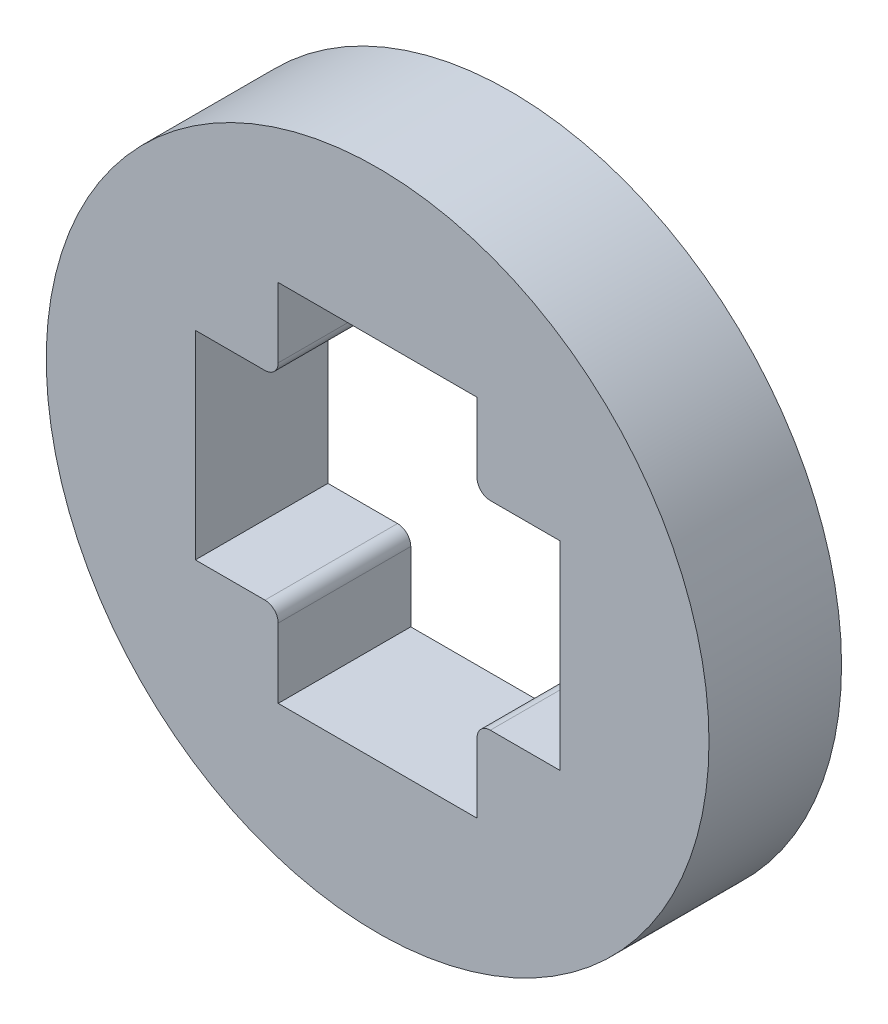
ISO-10303-21;
HEADER;
FILE_DESCRIPTION(('STEP AP214'),'2;1');
FILE_NAME('part.step','',(''),(''),'','','');
FILE_SCHEMA(('AUTOMOTIVE_DESIGN { 1 0 10303 214 1 1 1 1 }'));
ENDSEC;
DATA;
#1=APPLICATION_CONTEXT('core data for automotive mechanical design processes');
#2=APPLICATION_PROTOCOL_DEFINITION('international standard','automotive_design',2000,#1);
#3=PRODUCT_CONTEXT('',#1,'mechanical');
#4=PRODUCT('Part','Part','',(#3));
#5=PRODUCT_RELATED_PRODUCT_CATEGORY('part','',(#4));
#6=PRODUCT_DEFINITION_FORMATION('','',#4);
#7=PRODUCT_DEFINITION_CONTEXT('part definition',#1,'design');
#8=PRODUCT_DEFINITION('design','',#6,#7);
#9=PRODUCT_DEFINITION_SHAPE('','',#8);
#10=(LENGTH_UNIT() NAMED_UNIT(*) SI_UNIT(.MILLI.,.METRE.));
#11=(NAMED_UNIT(*) PLANE_ANGLE_UNIT() SI_UNIT($,.RADIAN.));
#12=(NAMED_UNIT(*) SI_UNIT($,.STERADIAN.) SOLID_ANGLE_UNIT());
#13=UNCERTAINTY_MEASURE_WITH_UNIT(LENGTH_MEASURE(1.E-05),#10,'distance_accuracy_value','');
#14=(GEOMETRIC_REPRESENTATION_CONTEXT(3) GLOBAL_UNCERTAINTY_ASSIGNED_CONTEXT((#13)) GLOBAL_UNIT_ASSIGNED_CONTEXT((#10,
#11,#12)) REPRESENTATION_CONTEXT('',''));
#15=CARTESIAN_POINT('',(0.,0.,0.));
#16=DIRECTION('',(0.,0.,1.));
#17=DIRECTION('',(1.,0.,0.));
#18=AXIS2_PLACEMENT_3D('',#15,#16,#17);
#19=CARTESIAN_POINT('',(-1.5,0.,2.));
#20=DIRECTION('',(1.,0.,0.));
#21=DIRECTION('',(0.,1.,0.));
#22=AXIS2_PLACEMENT_3D('',#19,#20,#21);
#23=PLANE('',#22);
#24=DIRECTION('',(0.,-1.,0.));
#25=VECTOR('',#24,1.);
#26=CARTESIAN_POINT('',(-1.5,0.,2.));
#27=LINE('',#26,#25);
#28=CARTESIAN_POINT('',(-1.5,2.75,2.));
#29=VERTEX_POINT('',#28);
#30=CARTESIAN_POINT('',(-1.5,1.7,2.));
#31=VERTEX_POINT('',#30);
#32=EDGE_CURVE('E152',#29,#31,#27,.T.);
#33=ORIENTED_EDGE('',*,*,#32,.T.);
#34=DIRECTION('',(0.,0.,-1.));
#35=VECTOR('',#34,1.);
#36=CARTESIAN_POINT('',(-1.5,1.7,0.));
#37=LINE('',#36,#35);
#38=CARTESIAN_POINT('',(-1.5,1.7,0.));
#39=VERTEX_POINT('',#38);
#40=EDGE_CURVE('E160',#31,#39,#37,.T.);
#41=ORIENTED_EDGE('',*,*,#40,.T.);
#42=DIRECTION('',(0.,-1.,0.));
#43=VECTOR('',#42,1.);
#44=CARTESIAN_POINT('',(-1.5,0.,0.));
#45=LINE('',#44,#43);
#46=CARTESIAN_POINT('',(-1.5,2.75,0.));
#47=VERTEX_POINT('',#46);
#48=EDGE_CURVE('E155',#47,#39,#45,.T.);
#49=ORIENTED_EDGE('',*,*,#48,.F.);
#50=DIRECTION('',(0.,0.,-1.));
#51=VECTOR('',#50,1.);
#52=CARTESIAN_POINT('',(-1.5,2.75,2.));
#53=LINE('',#52,#51);
#54=EDGE_CURVE('E149',#29,#47,#53,.T.);
#55=ORIENTED_EDGE('',*,*,#54,.F.);
#56=EDGE_LOOP('',(#33,#41,#49,#55));
#57=FACE_BOUND('',#56,.T.);
#58=ADVANCED_FACE('F35',(#57),#23,.T.);
#59=CARTESIAN_POINT('',(0.,2.75,2.));
#60=DIRECTION('',(0.,-1.,0.));
#61=DIRECTION('',(1.,0.,0.));
#62=AXIS2_PLACEMENT_3D('',#59,#60,#61);
#63=PLANE('',#62);
#64=DIRECTION('',(-1.,0.,0.));
#65=VECTOR('',#64,1.);
#66=CARTESIAN_POINT('',(0.,2.75,0.));
#67=LINE('',#66,#65);
#68=CARTESIAN_POINT('',(1.5,2.75,0.));
#69=VERTEX_POINT('',#68);
#70=EDGE_CURVE('E201',#69,#47,#67,.T.);
#71=ORIENTED_EDGE('',*,*,#70,.F.);
#72=DIRECTION('',(0.,0.,-1.));
#73=VECTOR('',#72,1.);
#74=CARTESIAN_POINT('',(1.5,2.75,2.));
#75=LINE('',#74,#73);
#76=CARTESIAN_POINT('',(1.5,2.75,2.));
#77=VERTEX_POINT('',#76);
#78=EDGE_CURVE('E161',#77,#69,#75,.T.);
#79=ORIENTED_EDGE('',*,*,#78,.F.);
#80=DIRECTION('',(-1.,0.,0.));
#81=VECTOR('',#80,1.);
#82=CARTESIAN_POINT('',(0.,2.75,2.));
#83=LINE('',#82,#81);
#84=EDGE_CURVE('E168',#77,#29,#83,.T.);
#85=ORIENTED_EDGE('',*,*,#84,.T.);
#86=ORIENTED_EDGE('',*,*,#54,.T.);
#87=EDGE_LOOP('',(#71,#79,#85,#86));
#88=FACE_BOUND('',#87,.T.);
#89=ADVANCED_FACE('F174',(#88),#63,.T.);
#90=CARTESIAN_POINT('',(1.5,0.,2.));
#91=DIRECTION('',(1.,0.,0.));
#92=DIRECTION('',(0.,1.,0.));
#93=AXIS2_PLACEMENT_3D('',#90,#91,#92);
#94=PLANE('',#93);
#95=DIRECTION('',(0.,-1.,0.));
#96=VECTOR('',#95,1.);
#97=CARTESIAN_POINT('',(1.5,0.,0.));
#98=LINE('',#97,#96);
#99=CARTESIAN_POINT('',(1.5,1.7,0.));
#100=VERTEX_POINT('',#99);
#101=EDGE_CURVE('E204',#69,#100,#98,.T.);
#102=ORIENTED_EDGE('',*,*,#101,.T.);
#103=DIRECTION('',(0.,0.,-1.));
#104=VECTOR('',#103,1.);
#105=CARTESIAN_POINT('',(1.5,1.7,2.));
#106=LINE('',#105,#104);
#107=CARTESIAN_POINT('',(1.5,1.7,2.));
#108=VERTEX_POINT('',#107);
#109=EDGE_CURVE('E11',#100,#108,#106,.F.);
#110=ORIENTED_EDGE('',*,*,#109,.T.);
#111=DIRECTION('',(0.,-1.,0.));
#112=VECTOR('',#111,1.);
#113=CARTESIAN_POINT('',(1.5,0.,2.));
#114=LINE('',#113,#112);
#115=EDGE_CURVE('E176',#77,#108,#114,.T.);
#116=ORIENTED_EDGE('',*,*,#115,.F.);
#117=ORIENTED_EDGE('',*,*,#78,.T.);
#118=EDGE_LOOP('',(#102,#110,#116,#117));
#119=FACE_BOUND('',#118,.T.);
#120=ADVANCED_FACE('F289',(#119),#94,.F.);
#121=CARTESIAN_POINT('',(0.,1.5,2.));
#122=DIRECTION('',(0.,1.,0.));
#123=DIRECTION('',(0.,0.,1.));
#124=AXIS2_PLACEMENT_3D('',#121,#122,#123);
#125=PLANE('',#124);
#126=DIRECTION('',(1.,0.,0.));
#127=VECTOR('',#126,1.);
#128=CARTESIAN_POINT('',(0.,1.5,2.));
#129=LINE('',#128,#127);
#130=CARTESIAN_POINT('',(1.7,1.5,2.));
#131=VERTEX_POINT('',#130);
#132=CARTESIAN_POINT('',(2.75,1.5,2.));
#133=VERTEX_POINT('',#132);
#134=EDGE_CURVE('E178',#131,#133,#129,.T.);
#135=ORIENTED_EDGE('',*,*,#134,.F.);
#136=DIRECTION('',(0.,0.,-1.));
#137=VECTOR('',#136,1.);
#138=CARTESIAN_POINT('',(1.7,1.5,2.));
#139=LINE('',#138,#137);
#140=CARTESIAN_POINT('',(1.7,1.5,0.));
#141=VERTEX_POINT('',#140);
#142=EDGE_CURVE('E43',#131,#141,#139,.T.);
#143=ORIENTED_EDGE('',*,*,#142,.T.);
#144=DIRECTION('',(1.,0.,0.));
#145=VECTOR('',#144,1.);
#146=CARTESIAN_POINT('',(0.,1.5,0.));
#147=LINE('',#146,#145);
#148=CARTESIAN_POINT('',(2.75,1.5,0.));
#149=VERTEX_POINT('',#148);
#150=EDGE_CURVE('E207',#141,#149,#147,.T.);
#151=ORIENTED_EDGE('',*,*,#150,.T.);
#152=DIRECTION('',(0.,0.,-1.));
#153=VECTOR('',#152,1.);
#154=CARTESIAN_POINT('',(2.75,1.5,2.));
#155=LINE('',#154,#153);
#156=EDGE_CURVE('E237',#133,#149,#155,.T.);
#157=ORIENTED_EDGE('',*,*,#156,.F.);
#158=EDGE_LOOP('',(#135,#143,#151,#157));
#159=FACE_BOUND('',#158,.T.);
#160=ADVANCED_FACE('F271',(#159),#125,.F.);
#161=CARTESIAN_POINT('',(2.75,0.,2.));
#162=DIRECTION('',(1.,0.,0.));
#163=DIRECTION('',(0.,1.,0.));
#164=AXIS2_PLACEMENT_3D('',#161,#162,#163);
#165=PLANE('',#164);
#166=DIRECTION('',(0.,-1.,0.));
#167=VECTOR('',#166,1.);
#168=CARTESIAN_POINT('',(2.75,0.,0.));
#169=LINE('',#168,#167);
#170=CARTESIAN_POINT('',(2.75,-1.5,0.));
#171=VERTEX_POINT('',#170);
#172=EDGE_CURVE('E210',#149,#171,#169,.T.);
#173=ORIENTED_EDGE('',*,*,#172,.T.);
#174=DIRECTION('',(0.,0.,-1.));
#175=VECTOR('',#174,1.);
#176=CARTESIAN_POINT('',(2.75,-1.5,2.));
#177=LINE('',#176,#175);
#178=CARTESIAN_POINT('',(2.75,-1.5,2.));
#179=VERTEX_POINT('',#178);
#180=EDGE_CURVE('E234',#179,#171,#177,.T.);
#181=ORIENTED_EDGE('',*,*,#180,.F.);
#182=DIRECTION('',(0.,-1.,0.));
#183=VECTOR('',#182,1.);
#184=CARTESIAN_POINT('',(2.75,0.,2.));
#185=LINE('',#184,#183);
#186=EDGE_CURVE('E183',#133,#179,#185,.T.);
#187=ORIENTED_EDGE('',*,*,#186,.F.);
#188=ORIENTED_EDGE('',*,*,#156,.T.);
#189=EDGE_LOOP('',(#173,#181,#187,#188));
#190=FACE_BOUND('',#189,.T.);
#191=ADVANCED_FACE('F283',(#190),#165,.F.);
#192=CARTESIAN_POINT('',(0.,-1.5,2.));
#193=DIRECTION('',(0.,1.,0.));
#194=DIRECTION('',(0.,0.,1.));
#195=AXIS2_PLACEMENT_3D('',#192,#193,#194);
#196=PLANE('',#195);
#197=DIRECTION('',(1.,0.,0.));
#198=VECTOR('',#197,1.);
#199=CARTESIAN_POINT('',(0.,-1.5,0.));
#200=LINE('',#199,#198);
#201=CARTESIAN_POINT('',(1.7,-1.5,0.));
#202=VERTEX_POINT('',#201);
#203=EDGE_CURVE('E214',#202,#171,#200,.T.);
#204=ORIENTED_EDGE('',*,*,#203,.F.);
#205=DIRECTION('',(0.,0.,-1.));
#206=VECTOR('',#205,1.);
#207=CARTESIAN_POINT('',(1.7,-1.5,2.));
#208=LINE('',#207,#206);
#209=CARTESIAN_POINT('',(1.7,-1.5,2.));
#210=VERTEX_POINT('',#209);
#211=EDGE_CURVE('E265',#202,#210,#208,.F.);
#212=ORIENTED_EDGE('',*,*,#211,.T.);
#213=DIRECTION('',(1.,0.,0.));
#214=VECTOR('',#213,1.);
#215=CARTESIAN_POINT('',(0.,-1.5,2.));
#216=LINE('',#215,#214);
#217=EDGE_CURVE('E187',#210,#179,#216,.T.);
#218=ORIENTED_EDGE('',*,*,#217,.T.);
#219=ORIENTED_EDGE('',*,*,#180,.T.);
#220=EDGE_LOOP('',(#204,#212,#218,#219));
#221=FACE_BOUND('',#220,.T.);
#222=ADVANCED_FACE('F328',(#221),#196,.T.);
#223=CARTESIAN_POINT('',(1.5,-1.7,2.));
#224=VERTEX_POINT('',#223);
#225=CARTESIAN_POINT('',(1.5,-2.75,2.));
#226=VERTEX_POINT('',#225);
#227=EDGE_CURVE('E180',#224,#226,#114,.T.);
#228=ORIENTED_EDGE('',*,*,#227,.F.);
#229=DIRECTION('',(0.,0.,-1.));
#230=VECTOR('',#229,1.);
#231=CARTESIAN_POINT('',(1.5,-1.7,0.));
#232=LINE('',#231,#230);
#233=CARTESIAN_POINT('',(1.5,-1.7,0.));
#234=VERTEX_POINT('',#233);
#235=EDGE_CURVE('E262',#224,#234,#232,.T.);
#236=ORIENTED_EDGE('',*,*,#235,.T.);
#237=CARTESIAN_POINT('',(1.5,-2.75,0.));
#238=VERTEX_POINT('',#237);
#239=EDGE_CURVE('E208',#234,#238,#98,.T.);
#240=ORIENTED_EDGE('',*,*,#239,.T.);
#241=DIRECTION('',(0.,0.,-1.));
#242=VECTOR('',#241,1.);
#243=CARTESIAN_POINT('',(1.5,-2.75,2.));
#244=LINE('',#243,#242);
#245=EDGE_CURVE('E231',#226,#238,#244,.T.);
#246=ORIENTED_EDGE('',*,*,#245,.F.);
#247=EDGE_LOOP('',(#228,#236,#240,#246));
#248=FACE_BOUND('',#247,.T.);
#249=ADVANCED_FACE('F329',(#248),#94,.F.);
#250=CARTESIAN_POINT('',(0.,-2.75,2.));
#251=DIRECTION('',(0.,-1.,0.));
#252=DIRECTION('',(0.,0.,-1.));
#253=AXIS2_PLACEMENT_3D('',#250,#251,#252);
#254=PLANE('',#253);
#255=DIRECTION('',(-1.,0.,0.));
#256=VECTOR('',#255,1.);
#257=CARTESIAN_POINT('',(0.,-2.75,0.));
#258=LINE('',#257,#256);
#259=CARTESIAN_POINT('',(-1.5,-2.75,0.));
#260=VERTEX_POINT('',#259);
#261=EDGE_CURVE('E217',#238,#260,#258,.T.);
#262=ORIENTED_EDGE('',*,*,#261,.T.);
#263=DIRECTION('',(0.,0.,-1.));
#264=VECTOR('',#263,1.);
#265=CARTESIAN_POINT('',(-1.5,-2.75,2.));
#266=LINE('',#265,#264);
#267=CARTESIAN_POINT('',(-1.5,-2.75,2.));
#268=VERTEX_POINT('',#267);
#269=EDGE_CURVE('E228',#268,#260,#266,.T.);
#270=ORIENTED_EDGE('',*,*,#269,.F.);
#271=DIRECTION('',(-1.,0.,0.));
#272=VECTOR('',#271,1.);
#273=CARTESIAN_POINT('',(0.,-2.75,2.));
#274=LINE('',#273,#272);
#275=EDGE_CURVE('E190',#226,#268,#274,.T.);
#276=ORIENTED_EDGE('',*,*,#275,.F.);
#277=ORIENTED_EDGE('',*,*,#245,.T.);
#278=EDGE_LOOP('',(#262,#270,#276,#277));
#279=FACE_BOUND('',#278,.T.);
#280=ADVANCED_FACE('F321',(#279),#254,.F.);
#281=CARTESIAN_POINT('',(-1.5,-1.7,0.));
#282=VERTEX_POINT('',#281);
#283=EDGE_CURVE('E202',#282,#260,#45,.T.);
#284=ORIENTED_EDGE('',*,*,#283,.F.);
#285=DIRECTION('',(0.,0.,-1.));
#286=VECTOR('',#285,1.);
#287=CARTESIAN_POINT('',(-1.5,-1.7,2.));
#288=LINE('',#287,#286);
#289=CARTESIAN_POINT('',(-1.5,-1.7,2.));
#290=VERTEX_POINT('',#289);
#291=EDGE_CURVE('E58',#282,#290,#288,.F.);
#292=ORIENTED_EDGE('',*,*,#291,.T.);
#293=EDGE_CURVE('E173',#290,#268,#27,.T.);
#294=ORIENTED_EDGE('',*,*,#293,.T.);
#295=ORIENTED_EDGE('',*,*,#269,.T.);
#296=EDGE_LOOP('',(#284,#292,#294,#295));
#297=FACE_BOUND('',#296,.T.);
#298=ADVANCED_FACE('F313',(#297),#23,.T.);
#299=CARTESIAN_POINT('',(-2.75,-1.5,2.));
#300=VERTEX_POINT('',#299);
#301=CARTESIAN_POINT('',(-1.7,-1.5,2.));
#302=VERTEX_POINT('',#301);
#303=EDGE_CURVE('E189',#300,#302,#216,.T.);
#304=ORIENTED_EDGE('',*,*,#303,.T.);
#305=DIRECTION('',(0.,0.,-1.));
#306=VECTOR('',#305,1.);
#307=CARTESIAN_POINT('',(-1.7,-1.5,2.));
#308=LINE('',#307,#306);
#309=CARTESIAN_POINT('',(-1.7,-1.5,0.));
#310=VERTEX_POINT('',#309);
#311=EDGE_CURVE('E258',#302,#310,#308,.T.);
#312=ORIENTED_EDGE('',*,*,#311,.T.);
#313=CARTESIAN_POINT('',(-2.75,-1.5,0.));
#314=VERTEX_POINT('',#313);
#315=EDGE_CURVE('E216',#314,#310,#200,.T.);
#316=ORIENTED_EDGE('',*,*,#315,.F.);
#317=DIRECTION('',(0.,0.,-1.));
#318=VECTOR('',#317,1.);
#319=CARTESIAN_POINT('',(-2.75,-1.5,2.));
#320=LINE('',#319,#318);
#321=EDGE_CURVE('E226',#300,#314,#320,.T.);
#322=ORIENTED_EDGE('',*,*,#321,.F.);
#323=EDGE_LOOP('',(#304,#312,#316,#322));
#324=FACE_BOUND('',#323,.T.);
#325=ADVANCED_FACE('F320',(#324),#196,.T.);
#326=CARTESIAN_POINT('',(-2.75,0.,2.));
#327=DIRECTION('',(1.,0.,0.));
#328=DIRECTION('',(0.,1.,0.));
#329=AXIS2_PLACEMENT_3D('',#326,#327,#328);
#330=PLANE('',#329);
#331=DIRECTION('',(0.,-1.,0.));
#332=VECTOR('',#331,1.);
#333=CARTESIAN_POINT('',(-2.75,0.,0.));
#334=LINE('',#333,#332);
#335=CARTESIAN_POINT('',(-2.75,1.5,0.));
#336=VERTEX_POINT('',#335);
#337=EDGE_CURVE('E220',#336,#314,#334,.T.);
#338=ORIENTED_EDGE('',*,*,#337,.F.);
#339=DIRECTION('',(0.,0.,-1.));
#340=VECTOR('',#339,1.);
#341=CARTESIAN_POINT('',(-2.75,1.5,2.));
#342=LINE('',#341,#340);
#343=CARTESIAN_POINT('',(-2.75,1.5,2.));
#344=VERTEX_POINT('',#343);
#345=EDGE_CURVE('E199',#344,#336,#342,.T.);
#346=ORIENTED_EDGE('',*,*,#345,.F.);
#347=DIRECTION('',(0.,-1.,0.));
#348=VECTOR('',#347,1.);
#349=CARTESIAN_POINT('',(-2.75,0.,2.));
#350=LINE('',#349,#348);
#351=EDGE_CURVE('E193',#344,#300,#350,.T.);
#352=ORIENTED_EDGE('',*,*,#351,.T.);
#353=ORIENTED_EDGE('',*,*,#321,.T.);
#354=EDGE_LOOP('',(#338,#346,#352,#353));
#355=FACE_BOUND('',#354,.T.);
#356=ADVANCED_FACE('F326',(#355),#330,.T.);
#357=CARTESIAN_POINT('',(-1.7,1.5,0.));
#358=VERTEX_POINT('',#357);
#359=EDGE_CURVE('E211',#336,#358,#147,.T.);
#360=ORIENTED_EDGE('',*,*,#359,.T.);
#361=DIRECTION('',(0.,0.,-1.));
#362=VECTOR('',#361,1.);
#363=CARTESIAN_POINT('',(-1.7,1.5,2.));
#364=LINE('',#363,#362);
#365=CARTESIAN_POINT('',(-1.7,1.5,2.));
#366=VERTEX_POINT('',#365);
#367=EDGE_CURVE('E250',#358,#366,#364,.F.);
#368=ORIENTED_EDGE('',*,*,#367,.T.);
#369=EDGE_CURVE('E184',#344,#366,#129,.T.);
#370=ORIENTED_EDGE('',*,*,#369,.F.);
#371=ORIENTED_EDGE('',*,*,#345,.T.);
#372=EDGE_LOOP('',(#360,#368,#370,#371));
#373=FACE_BOUND('',#372,.T.);
#374=ADVANCED_FACE('F296',(#373),#125,.F.);
#375=CARTESIAN_POINT('',(0.,0.,2.));
#376=DIRECTION('',(0.,0.,-1.));
#377=DIRECTION('',(-1.,0.,0.));
#378=AXIS2_PLACEMENT_3D('',#375,#376,#377);
#379=CYLINDRICAL_SURFACE('',#378,5.);
#380=CARTESIAN_POINT('',(0.,0.,2.));
#381=DIRECTION('',(0.,0.,1.));
#382=DIRECTION('',(1.,0.,0.));
#383=AXIS2_PLACEMENT_3D('',#380,#381,#382);
#384=CIRCLE('',#383,5.);
#385=CARTESIAN_POINT('',(5.,0.,2.));
#386=VERTEX_POINT('',#385);
#387=EDGE_CURVE('E196',#386,#386,#384,.T.);
#388=ORIENTED_EDGE('',*,*,#387,.F.);
#389=EDGE_LOOP('',(#388));
#390=FACE_BOUND('',#389,.T.);
#391=CARTESIAN_POINT('',(0.,0.,0.));
#392=DIRECTION('',(0.,0.,1.));
#393=DIRECTION('',(1.,0.,0.));
#394=AXIS2_PLACEMENT_3D('',#391,#392,#393);
#395=CIRCLE('',#394,5.);
#396=CARTESIAN_POINT('',(5.,0.,0.));
#397=VERTEX_POINT('',#396);
#398=EDGE_CURVE('E171',#397,#397,#395,.T.);
#399=ORIENTED_EDGE('',*,*,#398,.T.);
#400=EDGE_LOOP('',(#399));
#401=FACE_BOUND('',#400,.T.);
#402=ADVANCED_FACE('F359',(#390,#401),#379,.T.);
#403=CARTESIAN_POINT('',(0.,0.,2.));
#404=DIRECTION('',(0.,0.,1.));
#405=DIRECTION('',(1.,0.,0.));
#406=AXIS2_PLACEMENT_3D('',#403,#404,#405);
#407=PLANE('',#406);
#408=ORIENTED_EDGE('',*,*,#369,.T.);
#409=CARTESIAN_POINT('',(-1.7,1.7,2.));
#410=DIRECTION('',(0.,0.,1.));
#411=DIRECTION('',(1.,0.,0.));
#412=AXIS2_PLACEMENT_3D('',#409,#410,#411);
#413=CIRCLE('',#412,0.2);
#414=EDGE_CURVE('E170',#366,#31,#413,.T.);
#415=ORIENTED_EDGE('',*,*,#414,.T.);
#416=ORIENTED_EDGE('',*,*,#32,.F.);
#417=ORIENTED_EDGE('',*,*,#84,.F.);
#418=ORIENTED_EDGE('',*,*,#115,.T.);
#419=CARTESIAN_POINT('',(1.7,1.7,2.));
#420=DIRECTION('',(0.,0.,1.));
#421=DIRECTION('',(1.,0.,0.));
#422=AXIS2_PLACEMENT_3D('',#419,#420,#421);
#423=CIRCLE('',#422,0.2);
#424=EDGE_CURVE('E252',#108,#131,#423,.T.);
#425=ORIENTED_EDGE('',*,*,#424,.T.);
#426=ORIENTED_EDGE('',*,*,#134,.T.);
#427=ORIENTED_EDGE('',*,*,#186,.T.);
#428=ORIENTED_EDGE('',*,*,#217,.F.);
#429=CARTESIAN_POINT('',(1.7,-1.7,2.));
#430=DIRECTION('',(0.,0.,1.));
#431=DIRECTION('',(1.,0.,0.));
#432=AXIS2_PLACEMENT_3D('',#429,#430,#431);
#433=CIRCLE('',#432,0.2);
#434=EDGE_CURVE('E254',#210,#224,#433,.T.);
#435=ORIENTED_EDGE('',*,*,#434,.T.);
#436=ORIENTED_EDGE('',*,*,#227,.T.);
#437=ORIENTED_EDGE('',*,*,#275,.T.);
#438=ORIENTED_EDGE('',*,*,#293,.F.);
#439=CARTESIAN_POINT('',(-1.7,-1.7,2.));
#440=DIRECTION('',(0.,0.,1.));
#441=DIRECTION('',(1.,0.,0.));
#442=AXIS2_PLACEMENT_3D('',#439,#440,#441);
#443=CIRCLE('',#442,0.2);
#444=EDGE_CURVE('E50',#290,#302,#443,.T.);
#445=ORIENTED_EDGE('',*,*,#444,.T.);
#446=ORIENTED_EDGE('',*,*,#303,.F.);
#447=ORIENTED_EDGE('',*,*,#351,.F.);
#448=EDGE_LOOP('',(#408,#415,#416,#417,#418,#425,#426,#427,#428,#435,#436,#437,#438,#445,#446,#447));
#449=FACE_BOUND('',#448,.T.);
#450=ORIENTED_EDGE('',*,*,#387,.T.);
#451=EDGE_LOOP('',(#450));
#452=FACE_BOUND('',#451,.T.);
#453=ADVANCED_FACE('F165',(#449,#452),#407,.T.);
#454=CARTESIAN_POINT('',(0.,0.,0.));
#455=DIRECTION('',(0.,0.,1.));
#456=DIRECTION('',(1.,0.,0.));
#457=AXIS2_PLACEMENT_3D('',#454,#455,#456);
#458=PLANE('',#457);
#459=ORIENTED_EDGE('',*,*,#48,.T.);
#460=CARTESIAN_POINT('',(-1.7,1.7,0.));
#461=DIRECTION('',(0.,0.,1.));
#462=DIRECTION('',(1.,0.,0.));
#463=AXIS2_PLACEMENT_3D('',#460,#461,#462);
#464=CIRCLE('',#463,0.2);
#465=EDGE_CURVE('E248',#39,#358,#464,.F.);
#466=ORIENTED_EDGE('',*,*,#465,.T.);
#467=ORIENTED_EDGE('',*,*,#359,.F.);
#468=ORIENTED_EDGE('',*,*,#337,.T.);
#469=ORIENTED_EDGE('',*,*,#315,.T.);
#470=CARTESIAN_POINT('',(-1.7,-1.7,0.));
#471=DIRECTION('',(0.,0.,1.));
#472=DIRECTION('',(1.,0.,0.));
#473=AXIS2_PLACEMENT_3D('',#470,#471,#472);
#474=CIRCLE('',#473,0.2);
#475=EDGE_CURVE('E246',#310,#282,#474,.F.);
#476=ORIENTED_EDGE('',*,*,#475,.T.);
#477=ORIENTED_EDGE('',*,*,#283,.T.);
#478=ORIENTED_EDGE('',*,*,#261,.F.);
#479=ORIENTED_EDGE('',*,*,#239,.F.);
#480=CARTESIAN_POINT('',(1.7,-1.7,0.));
#481=DIRECTION('',(0.,0.,1.));
#482=DIRECTION('',(1.,0.,0.));
#483=AXIS2_PLACEMENT_3D('',#480,#481,#482);
#484=CIRCLE('',#483,0.2);
#485=EDGE_CURVE('E244',#234,#202,#484,.F.);
#486=ORIENTED_EDGE('',*,*,#485,.T.);
#487=ORIENTED_EDGE('',*,*,#203,.T.);
#488=ORIENTED_EDGE('',*,*,#172,.F.);
#489=ORIENTED_EDGE('',*,*,#150,.F.);
#490=CARTESIAN_POINT('',(1.7,1.7,0.));
#491=DIRECTION('',(0.,0.,1.));
#492=DIRECTION('',(1.,0.,0.));
#493=AXIS2_PLACEMENT_3D('',#490,#491,#492);
#494=CIRCLE('',#493,0.2);
#495=EDGE_CURVE('E242',#141,#100,#494,.F.);
#496=ORIENTED_EDGE('',*,*,#495,.T.);
#497=ORIENTED_EDGE('',*,*,#101,.F.);
#498=ORIENTED_EDGE('',*,*,#70,.T.);
#499=EDGE_LOOP('',(#459,#466,#467,#468,#469,#476,#477,#478,#479,#486,#487,#488,#489,#496,#497,#498));
#500=FACE_BOUND('',#499,.T.);
#501=ORIENTED_EDGE('',*,*,#398,.F.);
#502=EDGE_LOOP('',(#501));
#503=FACE_BOUND('',#502,.T.);
#504=ADVANCED_FACE('F277',(#500,#503),#458,.F.);
#505=CARTESIAN_POINT('',(-1.7,1.7,2.));
#506=DIRECTION('',(0.,0.,1.));
#507=DIRECTION('',(1.,0.,0.));
#508=AXIS2_PLACEMENT_3D('',#505,#506,#507);
#509=CYLINDRICAL_SURFACE('',#508,0.2);
#510=ORIENTED_EDGE('',*,*,#414,.F.);
#511=ORIENTED_EDGE('',*,*,#367,.F.);
#512=ORIENTED_EDGE('',*,*,#465,.F.);
#513=ORIENTED_EDGE('',*,*,#40,.F.);
#514=EDGE_LOOP('',(#510,#511,#512,#513));
#515=FACE_BOUND('',#514,.T.);
#516=ADVANCED_FACE('F298',(#515),#509,.T.);
#517=CARTESIAN_POINT('',(-1.7,-1.7,2.));
#518=DIRECTION('',(0.,0.,-1.));
#519=DIRECTION('',(-1.,0.,0.));
#520=AXIS2_PLACEMENT_3D('',#517,#518,#519);
#521=CYLINDRICAL_SURFACE('',#520,0.2);
#522=ORIENTED_EDGE('',*,*,#444,.F.);
#523=ORIENTED_EDGE('',*,*,#291,.F.);
#524=ORIENTED_EDGE('',*,*,#475,.F.);
#525=ORIENTED_EDGE('',*,*,#311,.F.);
#526=EDGE_LOOP('',(#522,#523,#524,#525));
#527=FACE_BOUND('',#526,.T.);
#528=ADVANCED_FACE('F300',(#527),#521,.T.);
#529=CARTESIAN_POINT('',(1.7,-1.7,2.));
#530=DIRECTION('',(0.,0.,1.));
#531=DIRECTION('',(1.,0.,0.));
#532=AXIS2_PLACEMENT_3D('',#529,#530,#531);
#533=CYLINDRICAL_SURFACE('',#532,0.2);
#534=ORIENTED_EDGE('',*,*,#434,.F.);
#535=ORIENTED_EDGE('',*,*,#211,.F.);
#536=ORIENTED_EDGE('',*,*,#485,.F.);
#537=ORIENTED_EDGE('',*,*,#235,.F.);
#538=EDGE_LOOP('',(#534,#535,#536,#537));
#539=FACE_BOUND('',#538,.T.);
#540=ADVANCED_FACE('F306',(#539),#533,.T.);
#541=CARTESIAN_POINT('',(1.7,1.7,2.));
#542=DIRECTION('',(0.,0.,-1.));
#543=DIRECTION('',(-1.,0.,0.));
#544=AXIS2_PLACEMENT_3D('',#541,#542,#543);
#545=CYLINDRICAL_SURFACE('',#544,0.2);
#546=ORIENTED_EDGE('',*,*,#424,.F.);
#547=ORIENTED_EDGE('',*,*,#109,.F.);
#548=ORIENTED_EDGE('',*,*,#495,.F.);
#549=ORIENTED_EDGE('',*,*,#142,.F.);
#550=EDGE_LOOP('',(#546,#547,#548,#549));
#551=FACE_BOUND('',#550,.T.);
#552=ADVANCED_FACE('F37',(#551),#545,.T.);
#553=CLOSED_SHELL('',(#58,#89,#120,#160,#191,#222,#249,#280,#298,#325,#356,#374,#402,#453,#504,
#516,#528,#540,#552));
#554=MANIFOLD_SOLID_BREP('B2',#553);
#555=ADVANCED_BREP_SHAPE_REPRESENTATION('',(#18,#554),#14);
#556=SHAPE_DEFINITION_REPRESENTATION(#9,#555);
ENDSEC;
END-ISO-10303-21;
